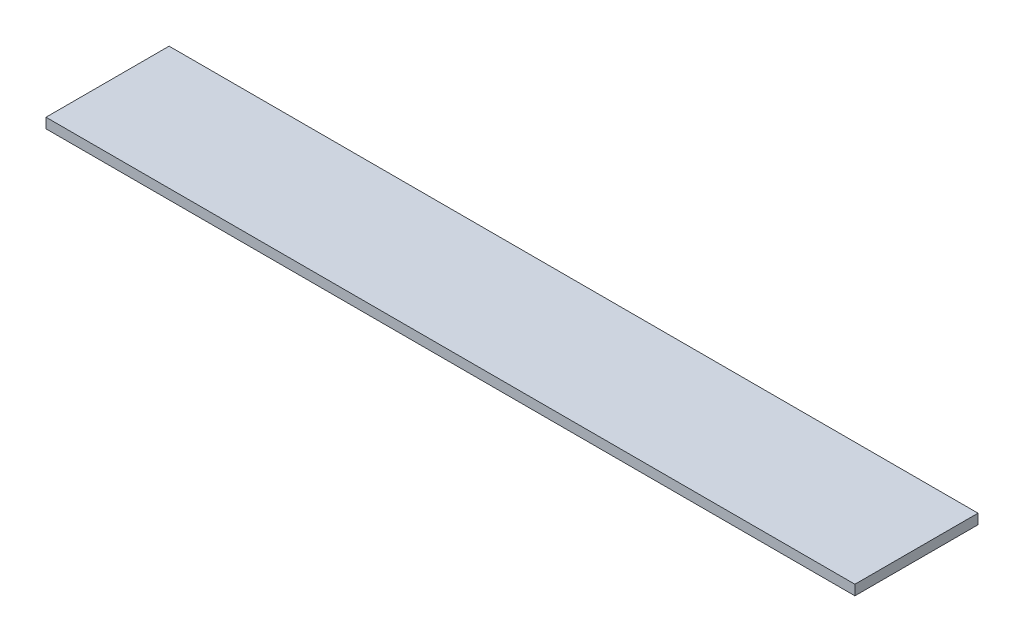
ISO-10303-21;
HEADER;
FILE_DESCRIPTION(('STEP AP214'),'2;1');
FILE_NAME('part.step','',(''),(''),'','','');
FILE_SCHEMA(('AUTOMOTIVE_DESIGN { 1 0 10303 214 1 1 1 1 }'));
ENDSEC;
DATA;
#1=APPLICATION_CONTEXT('core data for automotive mechanical design processes');
#2=APPLICATION_PROTOCOL_DEFINITION('international standard','automotive_design',2000,#1);
#3=PRODUCT_CONTEXT('',#1,'mechanical');
#4=PRODUCT('Part','Part','',(#3));
#5=PRODUCT_RELATED_PRODUCT_CATEGORY('part','',(#4));
#6=PRODUCT_DEFINITION_FORMATION('','',#4);
#7=PRODUCT_DEFINITION_CONTEXT('part definition',#1,'design');
#8=PRODUCT_DEFINITION('design','',#6,#7);
#9=PRODUCT_DEFINITION_SHAPE('','',#8);
#10=(LENGTH_UNIT() NAMED_UNIT(*) SI_UNIT(.MILLI.,.METRE.));
#11=(NAMED_UNIT(*) PLANE_ANGLE_UNIT() SI_UNIT($,.RADIAN.));
#12=(NAMED_UNIT(*) SI_UNIT($,.STERADIAN.) SOLID_ANGLE_UNIT());
#13=UNCERTAINTY_MEASURE_WITH_UNIT(LENGTH_MEASURE(1.E-05),#10,'distance_accuracy_value','');
#14=(GEOMETRIC_REPRESENTATION_CONTEXT(3) GLOBAL_UNCERTAINTY_ASSIGNED_CONTEXT((#13)) GLOBAL_UNIT_ASSIGNED_CONTEXT((#10,
#11,#12)) REPRESENTATION_CONTEXT('',''));
#15=CARTESIAN_POINT('',(0.,0.,0.));
#16=DIRECTION('',(0.,0.,1.));
#17=DIRECTION('',(1.,0.,0.));
#18=AXIS2_PLACEMENT_3D('',#15,#16,#17);
#19=CARTESIAN_POINT('',(0.,0.,28.));
#20=DIRECTION('',(1.,0.,0.));
#21=DIRECTION('',(0.,0.,-1.));
#22=AXIS2_PLACEMENT_3D('',#19,#20,#21);
#23=PLANE('',#22);
#24=DIRECTION('',(0.,-1.,0.));
#25=VECTOR('',#24,1.);
#26=CARTESIAN_POINT('',(0.,0.,0.));
#27=LINE('',#26,#25);
#28=CARTESIAN_POINT('',(0.,0.,0.));
#29=VERTEX_POINT('',#28);
#30=CARTESIAN_POINT('',(0.,-2.28987031363732,0.));
#31=VERTEX_POINT('',#30);
#32=EDGE_CURVE('E107',#29,#31,#27,.T.);
#33=ORIENTED_EDGE('',*,*,#32,.T.);
#34=DIRECTION('',(0.,0.,-1.));
#35=VECTOR('',#34,1.);
#36=CARTESIAN_POINT('',(0.,-2.28987031363732,28.));
#37=LINE('',#36,#35);
#38=CARTESIAN_POINT('',(0.,-2.28987031363732,28.));
#39=VERTEX_POINT('',#38);
#40=EDGE_CURVE('E11',#39,#31,#37,.T.);
#41=ORIENTED_EDGE('',*,*,#40,.F.);
#42=DIRECTION('',(0.,-1.,0.));
#43=VECTOR('',#42,1.);
#44=CARTESIAN_POINT('',(0.,0.,28.));
#45=LINE('',#44,#43);
#46=CARTESIAN_POINT('',(0.,0.,28.));
#47=VERTEX_POINT('',#46);
#48=EDGE_CURVE('E91',#47,#39,#45,.T.);
#49=ORIENTED_EDGE('',*,*,#48,.F.);
#50=DIRECTION('',(0.,0.,-1.));
#51=VECTOR('',#50,1.);
#52=CARTESIAN_POINT('',(0.,0.,28.));
#53=LINE('',#52,#51);
#54=EDGE_CURVE('E103',#47,#29,#53,.T.);
#55=ORIENTED_EDGE('',*,*,#54,.T.);
#56=EDGE_LOOP('',(#33,#41,#49,#55));
#57=FACE_BOUND('',#56,.T.);
#58=ADVANCED_FACE('F39',(#57),#23,.F.);
#59=CARTESIAN_POINT('',(0.,-2.28987031363732,28.));
#60=DIRECTION('',(0.,1.,0.));
#61=DIRECTION('',(-1.,0.,0.));
#62=AXIS2_PLACEMENT_3D('',#59,#60,#61);
#63=PLANE('',#62);
#64=DIRECTION('',(1.,0.,0.));
#65=VECTOR('',#64,1.);
#66=CARTESIAN_POINT('',(0.,-2.28987031363732,0.));
#67=LINE('',#66,#65);
#68=CARTESIAN_POINT('',(184.,-2.28987031363732,0.));
#69=VERTEX_POINT('',#68);
#70=EDGE_CURVE('E96',#31,#69,#67,.T.);
#71=ORIENTED_EDGE('',*,*,#70,.T.);
#72=DIRECTION('',(0.,0.,-1.));
#73=VECTOR('',#72,1.);
#74=CARTESIAN_POINT('',(184.,-2.28987031363732,28.));
#75=LINE('',#74,#73);
#76=CARTESIAN_POINT('',(184.,-2.28987031363732,28.));
#77=VERTEX_POINT('',#76);
#78=EDGE_CURVE('E48',#77,#69,#75,.T.);
#79=ORIENTED_EDGE('',*,*,#78,.F.);
#80=DIRECTION('',(1.,0.,0.));
#81=VECTOR('',#80,1.);
#82=CARTESIAN_POINT('',(0.,-2.28987031363732,28.));
#83=LINE('',#82,#81);
#84=EDGE_CURVE('E86',#39,#77,#83,.T.);
#85=ORIENTED_EDGE('',*,*,#84,.F.);
#86=ORIENTED_EDGE('',*,*,#40,.T.);
#87=EDGE_LOOP('',(#71,#79,#85,#86));
#88=FACE_BOUND('',#87,.T.);
#89=ADVANCED_FACE('F95',(#88),#63,.F.);
#90=CARTESIAN_POINT('',(184.,0.,28.));
#91=DIRECTION('',(-1.,0.,0.));
#92=DIRECTION('',(0.,0.,1.));
#93=AXIS2_PLACEMENT_3D('',#90,#91,#92);
#94=PLANE('',#93);
#95=DIRECTION('',(0.,1.,0.));
#96=VECTOR('',#95,1.);
#97=CARTESIAN_POINT('',(184.,0.,0.));
#98=LINE('',#97,#96);
#99=CARTESIAN_POINT('',(184.,0.,0.));
#100=VERTEX_POINT('',#99);
#101=EDGE_CURVE('E73',#69,#100,#98,.T.);
#102=ORIENTED_EDGE('',*,*,#101,.T.);
#103=DIRECTION('',(0.,0.,-1.));
#104=VECTOR('',#103,1.);
#105=CARTESIAN_POINT('',(184.,0.,28.));
#106=LINE('',#105,#104);
#107=CARTESIAN_POINT('',(184.,0.,28.));
#108=VERTEX_POINT('',#107);
#109=EDGE_CURVE('E98',#108,#100,#106,.T.);
#110=ORIENTED_EDGE('',*,*,#109,.F.);
#111=DIRECTION('',(0.,1.,0.));
#112=VECTOR('',#111,1.);
#113=CARTESIAN_POINT('',(184.,0.,28.));
#114=LINE('',#113,#112);
#115=EDGE_CURVE('E89',#77,#108,#114,.T.);
#116=ORIENTED_EDGE('',*,*,#115,.F.);
#117=ORIENTED_EDGE('',*,*,#78,.T.);
#118=EDGE_LOOP('',(#102,#110,#116,#117));
#119=FACE_BOUND('',#118,.T.);
#120=ADVANCED_FACE('F99',(#119),#94,.F.);
#121=CARTESIAN_POINT('',(0.,0.,28.));
#122=DIRECTION('',(0.,-1.,0.));
#123=DIRECTION('',(0.,0.,-1.));
#124=AXIS2_PLACEMENT_3D('',#121,#122,#123);
#125=PLANE('',#124);
#126=DIRECTION('',(-1.,0.,0.));
#127=VECTOR('',#126,1.);
#128=CARTESIAN_POINT('',(0.,0.,0.));
#129=LINE('',#128,#127);
#130=EDGE_CURVE('E79',#100,#29,#129,.T.);
#131=ORIENTED_EDGE('',*,*,#130,.T.);
#132=ORIENTED_EDGE('',*,*,#54,.F.);
#133=DIRECTION('',(-1.,0.,0.));
#134=VECTOR('',#133,1.);
#135=CARTESIAN_POINT('',(0.,0.,28.));
#136=LINE('',#135,#134);
#137=EDGE_CURVE('E56',#108,#47,#136,.T.);
#138=ORIENTED_EDGE('',*,*,#137,.F.);
#139=ORIENTED_EDGE('',*,*,#109,.T.);
#140=EDGE_LOOP('',(#131,#132,#138,#139));
#141=FACE_BOUND('',#140,.T.);
#142=ADVANCED_FACE('F120',(#141),#125,.F.);
#143=CARTESIAN_POINT('',(0.,0.,28.));
#144=DIRECTION('',(0.,0.,1.));
#145=DIRECTION('',(1.,0.,0.));
#146=AXIS2_PLACEMENT_3D('',#143,#144,#145);
#147=PLANE('',#146);
#148=ORIENTED_EDGE('',*,*,#48,.T.);
#149=ORIENTED_EDGE('',*,*,#84,.T.);
#150=ORIENTED_EDGE('',*,*,#115,.T.);
#151=ORIENTED_EDGE('',*,*,#137,.T.);
#152=EDGE_LOOP('',(#148,#149,#150,#151));
#153=FACE_BOUND('',#152,.T.);
#154=ADVANCED_FACE('F87',(#153),#147,.T.);
#155=CARTESIAN_POINT('',(0.,0.,0.));
#156=DIRECTION('',(0.,0.,1.));
#157=DIRECTION('',(1.,0.,0.));
#158=AXIS2_PLACEMENT_3D('',#155,#156,#157);
#159=PLANE('',#158);
#160=ORIENTED_EDGE('',*,*,#32,.F.);
#161=ORIENTED_EDGE('',*,*,#130,.F.);
#162=ORIENTED_EDGE('',*,*,#101,.F.);
#163=ORIENTED_EDGE('',*,*,#70,.F.);
#164=EDGE_LOOP('',(#160,#161,#162,#163));
#165=FACE_BOUND('',#164,.T.);
#166=ADVANCED_FACE('F123',(#165),#159,.F.);
#167=CLOSED_SHELL('',(#58,#89,#120,#142,#154,#166));
#168=MANIFOLD_SOLID_BREP('B2',#167);
#169=ADVANCED_BREP_SHAPE_REPRESENTATION('',(#18,#168),#14);
#170=SHAPE_DEFINITION_REPRESENTATION(#9,#169);
ENDSEC;
END-ISO-10303-21;
